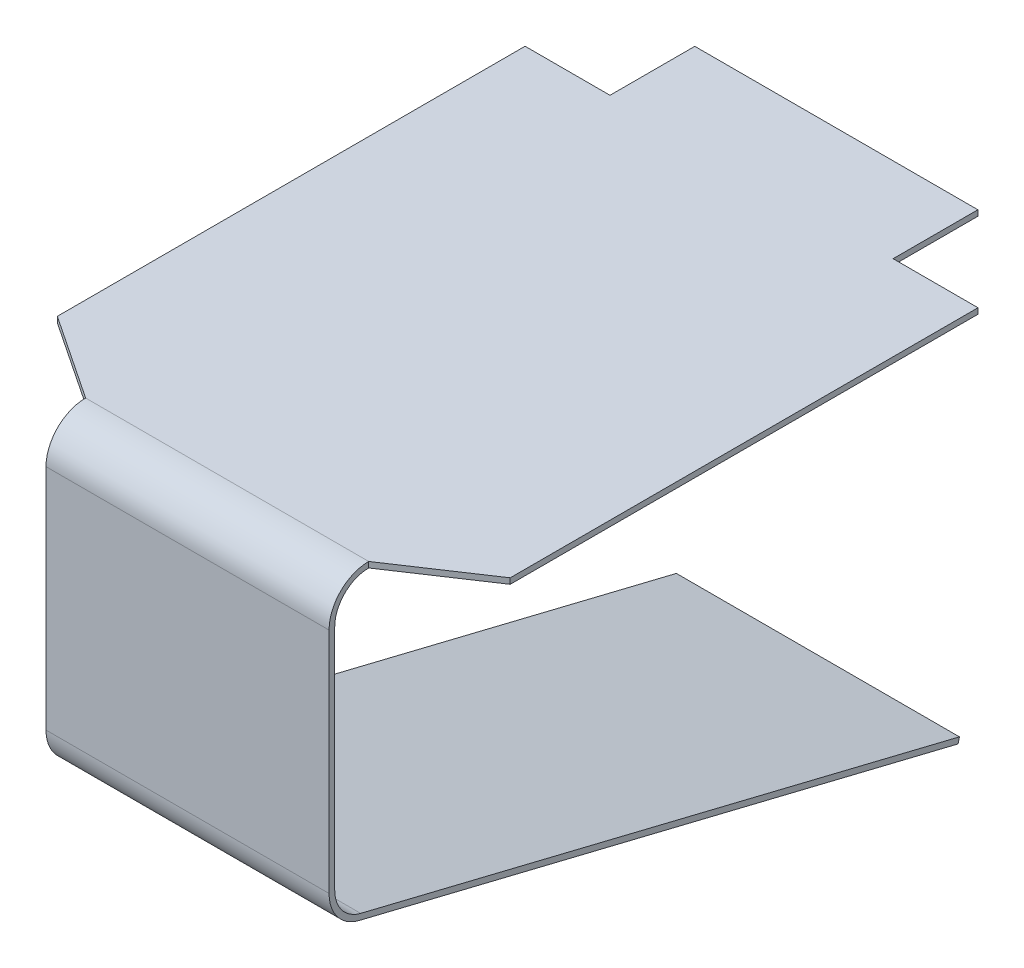
ISO-10303-21;
HEADER;
FILE_DESCRIPTION(('STEP AP214'),'2;1');
FILE_NAME('part.step','',(''),(''),'','','');
FILE_SCHEMA(('AUTOMOTIVE_DESIGN { 1 0 10303 214 1 1 1 1 }'));
ENDSEC;
DATA;
#1=APPLICATION_CONTEXT('core data for automotive mechanical design processes');
#2=APPLICATION_PROTOCOL_DEFINITION('international standard','automotive_design',2000,#1);
#3=PRODUCT_CONTEXT('',#1,'mechanical');
#4=PRODUCT('Part','Part','',(#3));
#5=PRODUCT_RELATED_PRODUCT_CATEGORY('part','',(#4));
#6=PRODUCT_DEFINITION_FORMATION('','',#4);
#7=PRODUCT_DEFINITION_CONTEXT('part definition',#1,'design');
#8=PRODUCT_DEFINITION('design','',#6,#7);
#9=PRODUCT_DEFINITION_SHAPE('','',#8);
#10=(LENGTH_UNIT() NAMED_UNIT(*) SI_UNIT(.MILLI.,.METRE.));
#11=(NAMED_UNIT(*) PLANE_ANGLE_UNIT() SI_UNIT($,.RADIAN.));
#12=(NAMED_UNIT(*) SI_UNIT($,.STERADIAN.) SOLID_ANGLE_UNIT());
#13=UNCERTAINTY_MEASURE_WITH_UNIT(LENGTH_MEASURE(1.E-05),#10,'distance_accuracy_value','');
#14=(GEOMETRIC_REPRESENTATION_CONTEXT(3) GLOBAL_UNCERTAINTY_ASSIGNED_CONTEXT((#13)) GLOBAL_UNIT_ASSIGNED_CONTEXT((#10,
#11,#12)) REPRESENTATION_CONTEXT('',''));
#15=CARTESIAN_POINT('',(0.,0.,0.));
#16=DIRECTION('',(0.,0.,1.));
#17=DIRECTION('',(1.,0.,0.));
#18=AXIS2_PLACEMENT_3D('',#15,#16,#17);
#19=CARTESIAN_POINT('',(-1.25,-2.31455604720542,5.38));
#20=DIRECTION('',(1.,0.,0.));
#21=DIRECTION('',(0.,0.,-1.));
#22=AXIS2_PLACEMENT_3D('',#19,#20,#21);
#23=PLANE('',#22);
#24=CARTESIAN_POINT('',(-1.25,-0.299999999999999,5.38));
#25=DIRECTION('',(1.,0.,0.));
#26=DIRECTION('',(0.,0.,-1.));
#27=AXIS2_PLACEMENT_3D('',#24,#25,#26);
#28=CIRCLE('',#27,0.35);
#29=CARTESIAN_POINT('',(-1.25,0.0500000000000008,5.38));
#30=VERTEX_POINT('',#29);
#31=CARTESIAN_POINT('',(-1.25,-0.300000000000001,5.73));
#32=VERTEX_POINT('',#31);
#33=EDGE_CURVE('E210',#30,#32,#28,.T.);
#34=ORIENTED_EDGE('',*,*,#33,.F.);
#35=DIRECTION('',(0.,-1.,0.));
#36=VECTOR('',#35,1.);
#37=CARTESIAN_POINT('',(-1.25,0.0500000000000008,5.38));
#38=LINE('',#37,#36);
#39=CARTESIAN_POINT('',(-1.25,0.,5.38));
#40=VERTEX_POINT('',#39);
#41=EDGE_CURVE('E181',#30,#40,#38,.T.);
#42=ORIENTED_EDGE('',*,*,#41,.T.);
#43=CARTESIAN_POINT('',(-1.25,-0.299999999999999,5.38));
#44=DIRECTION('',(1.,0.,0.));
#45=DIRECTION('',(0.,0.,1.));
#46=AXIS2_PLACEMENT_3D('',#43,#44,#45);
#47=CIRCLE('',#46,0.3);
#48=CARTESIAN_POINT('',(-1.25,-0.300000000000001,5.68));
#49=VERTEX_POINT('',#48);
#50=EDGE_CURVE('E284',#40,#49,#47,.T.);
#51=ORIENTED_EDGE('',*,*,#50,.T.);
#52=DIRECTION('',(0.,-1.,0.));
#53=VECTOR('',#52,1.);
#54=CARTESIAN_POINT('',(-1.25,-0.300000000000001,5.68));
#55=LINE('',#54,#53);
#56=CARTESIAN_POINT('',(-1.25,-2.31455604720542,5.68));
#57=VERTEX_POINT('',#56);
#58=EDGE_CURVE('E282',#49,#57,#55,.T.);
#59=ORIENTED_EDGE('',*,*,#58,.T.);
#60=CARTESIAN_POINT('',(-1.25,-2.31455604720542,5.38));
#61=DIRECTION('',(1.,0.,0.));
#62=DIRECTION('',(0.,0.,-1.));
#63=AXIS2_PLACEMENT_3D('',#60,#61,#62);
#64=CIRCLE('',#63,0.3);
#65=CARTESIAN_POINT('',(-1.25,-2.60595939018885,5.45130281690141));
#66=VERTEX_POINT('',#65);
#67=EDGE_CURVE('E280',#57,#66,#64,.T.);
#68=ORIENTED_EDGE('',*,*,#67,.T.);
#69=DIRECTION('',(0.,-0.237676056338028,-0.971344476611466));
#70=VECTOR('',#69,1.);
#71=CARTESIAN_POINT('',(-1.25,-2.60595939018885,5.45130281690141));
#72=LINE('',#71,#70);
#73=CARTESIAN_POINT('',(-1.25,-3.9,0.162763372846874));
#74=VERTEX_POINT('',#73);
#75=EDGE_CURVE('E278',#66,#74,#72,.T.);
#76=ORIENTED_EDGE('',*,*,#75,.T.);
#77=DIRECTION('',(0.,-0.971344476611468,0.237676056338017));
#78=VECTOR('',#77,1.);
#79=CARTESIAN_POINT('',(-1.25,-3.9,0.162763372846874));
#80=LINE('',#79,#78);
#81=CARTESIAN_POINT('',(-1.25,-3.94856722383057,0.174647175663775));
#82=VERTEX_POINT('',#81);
#83=EDGE_CURVE('E276',#74,#82,#80,.T.);
#84=ORIENTED_EDGE('',*,*,#83,.T.);
#85=DIRECTION('',(0.,-0.237676056338028,-0.971344476611466));
#86=VECTOR('',#85,1.);
#87=CARTESIAN_POINT('',(-1.25,-2.65452661401943,5.46318661971831));
#88=LINE('',#87,#86);
#89=CARTESIAN_POINT('',(-1.25,-2.65452661401943,5.46318661971831));
#90=VERTEX_POINT('',#89);
#91=EDGE_CURVE('E273',#90,#82,#88,.T.);
#92=ORIENTED_EDGE('',*,*,#91,.F.);
#93=CARTESIAN_POINT('',(-1.25,-2.31455604720542,5.38));
#94=DIRECTION('',(1.,0.,0.));
#95=DIRECTION('',(0.,0.,-1.));
#96=AXIS2_PLACEMENT_3D('',#93,#94,#95);
#97=CIRCLE('',#96,0.35);
#98=CARTESIAN_POINT('',(-1.25,-2.31455604720542,5.73));
#99=VERTEX_POINT('',#98);
#100=EDGE_CURVE('E220',#99,#90,#97,.T.);
#101=ORIENTED_EDGE('',*,*,#100,.F.);
#102=DIRECTION('',(0.,-1.,0.));
#103=VECTOR('',#102,1.);
#104=CARTESIAN_POINT('',(-1.25,-0.300000000000001,5.73));
#105=LINE('',#104,#103);
#106=EDGE_CURVE('E217',#32,#99,#105,.T.);
#107=ORIENTED_EDGE('',*,*,#106,.F.);
#108=EDGE_LOOP('',(#34,#42,#51,#59,#68,#76,#84,#92,#101,#107));
#109=FACE_BOUND('',#108,.T.);
#110=ADVANCED_FACE('F34',(#109),#23,.F.);
#111=CARTESIAN_POINT('',(1.25,-2.31455604720542,5.38));
#112=DIRECTION('',(1.,0.,0.));
#113=DIRECTION('',(0.,0.,-1.));
#114=AXIS2_PLACEMENT_3D('',#111,#112,#113);
#115=PLANE('',#114);
#116=DIRECTION('',(0.,-1.,0.));
#117=VECTOR('',#116,1.);
#118=CARTESIAN_POINT('',(1.25,0.0500000000000008,5.38));
#119=LINE('',#118,#117);
#120=CARTESIAN_POINT('',(1.25,0.0500000000000008,5.38));
#121=VERTEX_POINT('',#120);
#122=CARTESIAN_POINT('',(1.25,0.,5.38));
#123=VERTEX_POINT('',#122);
#124=EDGE_CURVE('E167',#121,#123,#119,.T.);
#125=ORIENTED_EDGE('',*,*,#124,.F.);
#126=CARTESIAN_POINT('',(1.25,-0.299999999999999,5.38));
#127=DIRECTION('',(1.,0.,0.));
#128=DIRECTION('',(0.,0.,-1.));
#129=AXIS2_PLACEMENT_3D('',#126,#127,#128);
#130=CIRCLE('',#129,0.35);
#131=CARTESIAN_POINT('',(1.25,-0.300000000000001,5.73));
#132=VERTEX_POINT('',#131);
#133=EDGE_CURVE('E264',#121,#132,#130,.T.);
#134=ORIENTED_EDGE('',*,*,#133,.T.);
#135=DIRECTION('',(0.,-1.,0.));
#136=VECTOR('',#135,1.);
#137=CARTESIAN_POINT('',(1.25,-0.300000000000001,5.73));
#138=LINE('',#137,#136);
#139=CARTESIAN_POINT('',(1.25,-2.31455604720542,5.73));
#140=VERTEX_POINT('',#139);
#141=EDGE_CURVE('E267',#132,#140,#138,.T.);
#142=ORIENTED_EDGE('',*,*,#141,.T.);
#143=CARTESIAN_POINT('',(1.25,-2.31455604720542,5.38));
#144=DIRECTION('',(1.,0.,0.));
#145=DIRECTION('',(0.,0.,-1.));
#146=AXIS2_PLACEMENT_3D('',#143,#144,#145);
#147=CIRCLE('',#146,0.35);
#148=CARTESIAN_POINT('',(1.25,-2.65452661401943,5.46318661971831));
#149=VERTEX_POINT('',#148);
#150=EDGE_CURVE('E270',#140,#149,#147,.T.);
#151=ORIENTED_EDGE('',*,*,#150,.T.);
#152=DIRECTION('',(0.,-0.237676056338028,-0.971344476611466));
#153=VECTOR('',#152,1.);
#154=CARTESIAN_POINT('',(1.25,-2.65452661401943,5.46318661971831));
#155=LINE('',#154,#153);
#156=CARTESIAN_POINT('',(1.25,-3.94856722383057,0.174647175663775));
#157=VERTEX_POINT('',#156);
#158=EDGE_CURVE('E329',#149,#157,#155,.T.);
#159=ORIENTED_EDGE('',*,*,#158,.T.);
#160=DIRECTION('',(0.,-0.971344476611468,0.237676056338017));
#161=VECTOR('',#160,1.);
#162=CARTESIAN_POINT('',(1.25,-3.9,0.162763372846874));
#163=LINE('',#162,#161);
#164=CARTESIAN_POINT('',(1.25,-3.9,0.162763372846874));
#165=VERTEX_POINT('',#164);
#166=EDGE_CURVE('E561',#165,#157,#163,.T.);
#167=ORIENTED_EDGE('',*,*,#166,.F.);
#168=DIRECTION('',(0.,-0.237676056338028,-0.971344476611466));
#169=VECTOR('',#168,1.);
#170=CARTESIAN_POINT('',(1.25,-2.60595939018885,5.45130281690141));
#171=LINE('',#170,#169);
#172=CARTESIAN_POINT('',(1.25,-2.60595939018885,5.45130281690141));
#173=VERTEX_POINT('',#172);
#174=EDGE_CURVE('E564',#173,#165,#171,.T.);
#175=ORIENTED_EDGE('',*,*,#174,.F.);
#176=CARTESIAN_POINT('',(1.25,-2.31455604720542,5.38));
#177=DIRECTION('',(1.,0.,0.));
#178=DIRECTION('',(0.,0.,-1.));
#179=AXIS2_PLACEMENT_3D('',#176,#177,#178);
#180=CIRCLE('',#179,0.3);
#181=CARTESIAN_POINT('',(1.25,-2.31455604720542,5.68));
#182=VERTEX_POINT('',#181);
#183=EDGE_CURVE('E565',#182,#173,#180,.T.);
#184=ORIENTED_EDGE('',*,*,#183,.F.);
#185=DIRECTION('',(0.,-1.,0.));
#186=VECTOR('',#185,1.);
#187=CARTESIAN_POINT('',(1.25,-0.300000000000001,5.68));
#188=LINE('',#187,#186);
#189=CARTESIAN_POINT('',(1.25,-0.300000000000001,5.68));
#190=VERTEX_POINT('',#189);
#191=EDGE_CURVE('E569',#190,#182,#188,.T.);
#192=ORIENTED_EDGE('',*,*,#191,.F.);
#193=CARTESIAN_POINT('',(1.25,-0.299999999999999,5.38));
#194=DIRECTION('',(1.,0.,0.));
#195=DIRECTION('',(0.,0.,1.));
#196=AXIS2_PLACEMENT_3D('',#193,#194,#195);
#197=CIRCLE('',#196,0.3);
#198=EDGE_CURVE('E253',#123,#190,#197,.T.);
#199=ORIENTED_EDGE('',*,*,#198,.F.);
#200=EDGE_LOOP('',(#125,#134,#142,#151,#159,#167,#175,#184,#192,#199));
#201=FACE_BOUND('',#200,.T.);
#202=ADVANCED_FACE('F314',(#201),#115,.T.);
#203=CARTESIAN_POINT('',(-1.25,-2.65452661401943,5.46318661971831));
#204=DIRECTION('',(0.,-0.971344476611466,0.237676056338028));
#205=DIRECTION('',(0.,-0.237676056338028,-0.971344476611466));
#206=AXIS2_PLACEMENT_3D('',#203,#204,#205);
#207=PLANE('',#206);
#208=DIRECTION('',(1.,0.,0.));
#209=VECTOR('',#208,1.);
#210=CARTESIAN_POINT('',(-1.25,-3.94856722383057,0.174647175663775));
#211=LINE('',#210,#209);
#212=EDGE_CURVE('E223',#82,#157,#211,.T.);
#213=ORIENTED_EDGE('',*,*,#212,.T.);
#214=ORIENTED_EDGE('',*,*,#158,.F.);
#215=DIRECTION('',(1.,0.,0.));
#216=VECTOR('',#215,1.);
#217=CARTESIAN_POINT('',(-1.25,-2.65452661401943,5.46318661971831));
#218=LINE('',#217,#216);
#219=EDGE_CURVE('E224',#90,#149,#218,.T.);
#220=ORIENTED_EDGE('',*,*,#219,.F.);
#221=ORIENTED_EDGE('',*,*,#91,.T.);
#222=EDGE_LOOP('',(#213,#214,#220,#221));
#223=FACE_BOUND('',#222,.T.);
#224=ADVANCED_FACE('F365',(#223),#207,.T.);
#225=CARTESIAN_POINT('',(-1.25,-2.31455604720542,5.38));
#226=DIRECTION('',(1.,0.,0.));
#227=DIRECTION('',(0.,0.,-1.));
#228=AXIS2_PLACEMENT_3D('',#225,#226,#227);
#229=CYLINDRICAL_SURFACE('',#228,0.35);
#230=ORIENTED_EDGE('',*,*,#219,.T.);
#231=ORIENTED_EDGE('',*,*,#150,.F.);
#232=DIRECTION('',(1.,0.,0.));
#233=VECTOR('',#232,1.);
#234=CARTESIAN_POINT('',(-1.25,-2.31455604720542,5.73));
#235=LINE('',#234,#233);
#236=EDGE_CURVE('E226',#99,#140,#235,.T.);
#237=ORIENTED_EDGE('',*,*,#236,.F.);
#238=ORIENTED_EDGE('',*,*,#100,.T.);
#239=EDGE_LOOP('',(#230,#231,#237,#238));
#240=FACE_BOUND('',#239,.T.);
#241=ADVANCED_FACE('F370',(#240),#229,.T.);
#242=CARTESIAN_POINT('',(-1.25,-0.300000000000001,5.73));
#243=DIRECTION('',(0.,0.,1.));
#244=DIRECTION('',(0.,-1.,0.));
#245=AXIS2_PLACEMENT_3D('',#242,#243,#244);
#246=PLANE('',#245);
#247=ORIENTED_EDGE('',*,*,#236,.T.);
#248=ORIENTED_EDGE('',*,*,#141,.F.);
#249=DIRECTION('',(1.,0.,0.));
#250=VECTOR('',#249,1.);
#251=CARTESIAN_POINT('',(-1.25,-0.300000000000001,5.73));
#252=LINE('',#251,#250);
#253=EDGE_CURVE('E228',#32,#132,#252,.T.);
#254=ORIENTED_EDGE('',*,*,#253,.F.);
#255=ORIENTED_EDGE('',*,*,#106,.T.);
#256=EDGE_LOOP('',(#247,#248,#254,#255));
#257=FACE_BOUND('',#256,.T.);
#258=ADVANCED_FACE('F311',(#257),#246,.T.);
#259=CARTESIAN_POINT('',(-1.25,-0.299999999999999,5.38));
#260=DIRECTION('',(1.,0.,0.));
#261=DIRECTION('',(0.,0.,-1.));
#262=AXIS2_PLACEMENT_3D('',#259,#260,#261);
#263=CYLINDRICAL_SURFACE('',#262,0.35);
#264=ORIENTED_EDGE('',*,*,#253,.T.);
#265=ORIENTED_EDGE('',*,*,#133,.F.);
#266=DIRECTION('',(1.,0.,0.));
#267=VECTOR('',#266,1.);
#268=CARTESIAN_POINT('',(-1.25,0.0500000000000008,5.38));
#269=LINE('',#268,#267);
#270=EDGE_CURVE('E230',#30,#121,#269,.T.);
#271=ORIENTED_EDGE('',*,*,#270,.F.);
#272=ORIENTED_EDGE('',*,*,#33,.T.);
#273=EDGE_LOOP('',(#264,#265,#271,#272));
#274=FACE_BOUND('',#273,.T.);
#275=ADVANCED_FACE('F306',(#274),#263,.T.);
#276=CARTESIAN_POINT('',(-1.25,0.05,0.));
#277=DIRECTION('',(0.,1.,0.));
#278=DIRECTION('',(0.,0.,1.));
#279=AXIS2_PLACEMENT_3D('',#276,#277,#278);
#280=PLANE('',#279);
#281=DIRECTION('',(0.,0.,1.));
#282=VECTOR('',#281,1.);
#283=CARTESIAN_POINT('',(-2.,0.0500000000000008,5.38));
#284=LINE('',#283,#282);
#285=CARTESIAN_POINT('',(-2.,0.0500000000000008,0.74883453473747));
#286=VERTEX_POINT('',#285);
#287=CARTESIAN_POINT('',(-2.,0.0500000000000008,4.88));
#288=VERTEX_POINT('',#287);
#289=EDGE_CURVE('E159',#286,#288,#284,.T.);
#290=ORIENTED_EDGE('',*,*,#289,.T.);
#291=DIRECTION('',(-0.832050294337844,0.,-0.554700196225228));
#292=VECTOR('',#291,1.);
#293=CARTESIAN_POINT('',(-3.73307692307692,0.0500000000000006,3.72461538461539));
#294=LINE('',#293,#292);
#295=EDGE_CURVE('E11',#288,#30,#294,.F.);
#296=ORIENTED_EDGE('',*,*,#295,.T.);
#297=ORIENTED_EDGE('',*,*,#270,.T.);
#298=DIRECTION('',(0.832050294337844,0.,-0.554700196225228));
#299=VECTOR('',#298,1.);
#300=CARTESIAN_POINT('',(2.00230769230769,0.0500000000000007,4.87846153846154));
#301=LINE('',#300,#299);
#302=CARTESIAN_POINT('',(2.,0.0500000000000008,4.88));
#303=VERTEX_POINT('',#302);
#304=EDGE_CURVE('E199',#121,#303,#301,.T.);
#305=ORIENTED_EDGE('',*,*,#304,.T.);
#306=DIRECTION('',(0.,0.,1.));
#307=VECTOR('',#306,1.);
#308=CARTESIAN_POINT('',(2.,0.0500000000000008,5.38));
#309=LINE('',#308,#307);
#310=CARTESIAN_POINT('',(2.,0.0500000000000008,0.74883453473747));
#311=VERTEX_POINT('',#310);
#312=EDGE_CURVE('E326',#311,#303,#309,.T.);
#313=ORIENTED_EDGE('',*,*,#312,.F.);
#314=DIRECTION('',(-1.,0.,0.));
#315=VECTOR('',#314,1.);
#316=CARTESIAN_POINT('',(2.,0.0500000000000008,0.74883453473747));
#317=LINE('',#316,#315);
#318=CARTESIAN_POINT('',(1.25,0.0500000000000008,0.74883453473747));
#319=VERTEX_POINT('',#318);
#320=EDGE_CURVE('E332',#311,#319,#317,.T.);
#321=ORIENTED_EDGE('',*,*,#320,.T.);
#322=DIRECTION('',(0.,0.,1.));
#323=VECTOR('',#322,1.);
#324=CARTESIAN_POINT('',(1.25,0.05,0.));
#325=LINE('',#324,#323);
#326=CARTESIAN_POINT('',(1.25,0.05,0.));
#327=VERTEX_POINT('',#326);
#328=EDGE_CURVE('E254',#327,#319,#325,.T.);
#329=ORIENTED_EDGE('',*,*,#328,.F.);
#330=DIRECTION('',(1.,0.,0.));
#331=VECTOR('',#330,1.);
#332=CARTESIAN_POINT('',(-1.25,0.05,0.));
#333=LINE('',#332,#331);
#334=CARTESIAN_POINT('',(-1.25,0.05,0.));
#335=VERTEX_POINT('',#334);
#336=EDGE_CURVE('E232',#335,#327,#333,.T.);
#337=ORIENTED_EDGE('',*,*,#336,.F.);
#338=DIRECTION('',(0.,0.,1.));
#339=VECTOR('',#338,1.);
#340=CARTESIAN_POINT('',(-1.25,0.05,0.));
#341=LINE('',#340,#339);
#342=CARTESIAN_POINT('',(-1.25,0.0500000000000001,0.74883453473747));
#343=VERTEX_POINT('',#342);
#344=EDGE_CURVE('E162',#335,#343,#341,.T.);
#345=ORIENTED_EDGE('',*,*,#344,.T.);
#346=DIRECTION('',(1.,0.,0.));
#347=VECTOR('',#346,1.);
#348=CARTESIAN_POINT('',(-2.,0.0500000000000008,0.74883453473747));
#349=LINE('',#348,#347);
#350=EDGE_CURVE('E157',#286,#343,#349,.T.);
#351=ORIENTED_EDGE('',*,*,#350,.F.);
#352=EDGE_LOOP('',(#290,#296,#297,#305,#313,#321,#329,#337,#345,#351));
#353=FACE_BOUND('',#352,.T.);
#354=ADVANCED_FACE('F158',(#353),#280,.T.);
#355=CARTESIAN_POINT('',(-1.25,0.05,0.));
#356=DIRECTION('',(0.,0.,1.));
#357=DIRECTION('',(0.,-1.,0.));
#358=AXIS2_PLACEMENT_3D('',#355,#356,#357);
#359=PLANE('',#358);
#360=ORIENTED_EDGE('',*,*,#336,.T.);
#361=DIRECTION('',(0.,-1.,0.));
#362=VECTOR('',#361,1.);
#363=CARTESIAN_POINT('',(1.25,0.05,0.));
#364=LINE('',#363,#362);
#365=CARTESIAN_POINT('',(1.25,0.,0.));
#366=VERTEX_POINT('',#365);
#367=EDGE_CURVE('E252',#327,#366,#364,.T.);
#368=ORIENTED_EDGE('',*,*,#367,.T.);
#369=DIRECTION('',(1.,0.,0.));
#370=VECTOR('',#369,1.);
#371=CARTESIAN_POINT('',(-1.25,0.,0.));
#372=LINE('',#371,#370);
#373=CARTESIAN_POINT('',(-1.25,0.,0.));
#374=VERTEX_POINT('',#373);
#375=EDGE_CURVE('E234',#374,#366,#372,.T.);
#376=ORIENTED_EDGE('',*,*,#375,.F.);
#377=DIRECTION('',(0.,-1.,0.));
#378=VECTOR('',#377,1.);
#379=CARTESIAN_POINT('',(-1.25,0.05,0.));
#380=LINE('',#379,#378);
#381=EDGE_CURVE('E211',#335,#374,#380,.T.);
#382=ORIENTED_EDGE('',*,*,#381,.F.);
#383=EDGE_LOOP('',(#360,#368,#376,#382));
#384=FACE_BOUND('',#383,.T.);
#385=ADVANCED_FACE('F296',(#384),#359,.F.);
#386=CARTESIAN_POINT('',(-1.25,0.,0.));
#387=DIRECTION('',(0.,1.,0.));
#388=DIRECTION('',(0.,0.,1.));
#389=AXIS2_PLACEMENT_3D('',#386,#387,#388);
#390=PLANE('',#389);
#391=DIRECTION('',(1.,0.,0.));
#392=VECTOR('',#391,1.);
#393=CARTESIAN_POINT('',(-1.25,0.,5.38));
#394=LINE('',#393,#392);
#395=EDGE_CURVE('E236',#40,#123,#394,.T.);
#396=ORIENTED_EDGE('',*,*,#395,.F.);
#397=DIRECTION('',(0.832050294337844,0.,0.554700196225228));
#398=VECTOR('',#397,1.);
#399=CARTESIAN_POINT('',(-1.25,0.,5.38));
#400=LINE('',#399,#398);
#401=CARTESIAN_POINT('',(-2.,0.,4.88));
#402=VERTEX_POINT('',#401);
#403=EDGE_CURVE('E56',#40,#402,#400,.F.);
#404=ORIENTED_EDGE('',*,*,#403,.T.);
#405=DIRECTION('',(0.,0.,-1.));
#406=VECTOR('',#405,1.);
#407=CARTESIAN_POINT('',(-2.,0.,5.38));
#408=LINE('',#407,#406);
#409=CARTESIAN_POINT('',(-2.,0.,0.74883453473747));
#410=VERTEX_POINT('',#409);
#411=EDGE_CURVE('E177',#402,#410,#408,.T.);
#412=ORIENTED_EDGE('',*,*,#411,.T.);
#413=DIRECTION('',(1.,0.,0.));
#414=VECTOR('',#413,1.);
#415=CARTESIAN_POINT('',(-2.,0.,0.74883453473747));
#416=LINE('',#415,#414);
#417=CARTESIAN_POINT('',(-1.25,0.,0.74883453473747));
#418=VERTEX_POINT('',#417);
#419=EDGE_CURVE('E168',#410,#418,#416,.T.);
#420=ORIENTED_EDGE('',*,*,#419,.T.);
#421=DIRECTION('',(0.,0.,1.));
#422=VECTOR('',#421,1.);
#423=CARTESIAN_POINT('',(-1.25,0.,0.));
#424=LINE('',#423,#422);
#425=EDGE_CURVE('E190',#374,#418,#424,.T.);
#426=ORIENTED_EDGE('',*,*,#425,.F.);
#427=ORIENTED_EDGE('',*,*,#375,.T.);
#428=DIRECTION('',(0.,0.,1.));
#429=VECTOR('',#428,1.);
#430=CARTESIAN_POINT('',(1.25,0.,0.));
#431=LINE('',#430,#429);
#432=CARTESIAN_POINT('',(1.25,0.,0.74883453473747));
#433=VERTEX_POINT('',#432);
#434=EDGE_CURVE('E248',#366,#433,#431,.T.);
#435=ORIENTED_EDGE('',*,*,#434,.T.);
#436=DIRECTION('',(-1.,0.,0.));
#437=VECTOR('',#436,1.);
#438=CARTESIAN_POINT('',(2.,0.,0.74883453473747));
#439=LINE('',#438,#437);
#440=CARTESIAN_POINT('',(2.,0.,0.74883453473747));
#441=VERTEX_POINT('',#440);
#442=EDGE_CURVE('E335',#441,#433,#439,.T.);
#443=ORIENTED_EDGE('',*,*,#442,.F.);
#444=DIRECTION('',(0.,0.,-1.));
#445=VECTOR('',#444,1.);
#446=CARTESIAN_POINT('',(2.,0.,5.38));
#447=LINE('',#446,#445);
#448=CARTESIAN_POINT('',(2.,0.,4.88));
#449=VERTEX_POINT('',#448);
#450=EDGE_CURVE('E186',#449,#441,#447,.T.);
#451=ORIENTED_EDGE('',*,*,#450,.F.);
#452=DIRECTION('',(-0.832050294337844,0.,0.554700196225228));
#453=VECTOR('',#452,1.);
#454=CARTESIAN_POINT('',(2.,0.,4.88));
#455=LINE('',#454,#453);
#456=EDGE_CURVE('E200',#449,#123,#455,.T.);
#457=ORIENTED_EDGE('',*,*,#456,.T.);
#458=EDGE_LOOP('',(#396,#404,#412,#420,#426,#427,#435,#443,#451,#457));
#459=FACE_BOUND('',#458,.T.);
#460=ADVANCED_FACE('F299',(#459),#390,.F.);
#461=CARTESIAN_POINT('',(-1.25,-0.299999999999999,5.38));
#462=DIRECTION('',(1.,0.,0.));
#463=DIRECTION('',(0.,0.,-1.));
#464=AXIS2_PLACEMENT_3D('',#461,#462,#463);
#465=CYLINDRICAL_SURFACE('',#464,0.3);
#466=ORIENTED_EDGE('',*,*,#395,.T.);
#467=ORIENTED_EDGE('',*,*,#198,.T.);
#468=DIRECTION('',(1.,0.,0.));
#469=VECTOR('',#468,1.);
#470=CARTESIAN_POINT('',(-1.25,-0.300000000000001,5.68));
#471=LINE('',#470,#469);
#472=EDGE_CURVE('E239',#49,#190,#471,.T.);
#473=ORIENTED_EDGE('',*,*,#472,.F.);
#474=ORIENTED_EDGE('',*,*,#50,.F.);
#475=EDGE_LOOP('',(#466,#467,#473,#474));
#476=FACE_BOUND('',#475,.T.);
#477=ADVANCED_FACE('F384',(#476),#465,.F.);
#478=CARTESIAN_POINT('',(-1.25,-0.300000000000001,5.68));
#479=DIRECTION('',(0.,0.,1.));
#480=DIRECTION('',(0.,-1.,0.));
#481=AXIS2_PLACEMENT_3D('',#478,#479,#480);
#482=PLANE('',#481);
#483=ORIENTED_EDGE('',*,*,#472,.T.);
#484=ORIENTED_EDGE('',*,*,#191,.T.);
#485=DIRECTION('',(1.,0.,0.));
#486=VECTOR('',#485,1.);
#487=CARTESIAN_POINT('',(-1.25,-2.31455604720542,5.68));
#488=LINE('',#487,#486);
#489=EDGE_CURVE('E241',#57,#182,#488,.T.);
#490=ORIENTED_EDGE('',*,*,#489,.F.);
#491=ORIENTED_EDGE('',*,*,#58,.F.);
#492=EDGE_LOOP('',(#483,#484,#490,#491));
#493=FACE_BOUND('',#492,.T.);
#494=ADVANCED_FACE('F387',(#493),#482,.F.);
#495=CARTESIAN_POINT('',(-1.25,-2.31455604720542,5.38));
#496=DIRECTION('',(1.,0.,0.));
#497=DIRECTION('',(0.,0.,-1.));
#498=AXIS2_PLACEMENT_3D('',#495,#496,#497);
#499=CYLINDRICAL_SURFACE('',#498,0.3);
#500=ORIENTED_EDGE('',*,*,#489,.T.);
#501=ORIENTED_EDGE('',*,*,#183,.T.);
#502=DIRECTION('',(1.,0.,0.));
#503=VECTOR('',#502,1.);
#504=CARTESIAN_POINT('',(-1.25,-2.60595939018885,5.45130281690141));
#505=LINE('',#504,#503);
#506=EDGE_CURVE('E243',#66,#173,#505,.T.);
#507=ORIENTED_EDGE('',*,*,#506,.F.);
#508=ORIENTED_EDGE('',*,*,#67,.F.);
#509=EDGE_LOOP('',(#500,#501,#507,#508));
#510=FACE_BOUND('',#509,.T.);
#511=ADVANCED_FACE('F391',(#510),#499,.F.);
#512=CARTESIAN_POINT('',(-1.25,-2.60595939018885,5.45130281690141));
#513=DIRECTION('',(0.,-0.971344476611466,0.237676056338028));
#514=DIRECTION('',(0.,-0.237676056338028,-0.971344476611466));
#515=AXIS2_PLACEMENT_3D('',#512,#513,#514);
#516=PLANE('',#515);
#517=ORIENTED_EDGE('',*,*,#506,.T.);
#518=ORIENTED_EDGE('',*,*,#174,.T.);
#519=DIRECTION('',(1.,0.,0.));
#520=VECTOR('',#519,1.);
#521=CARTESIAN_POINT('',(-1.25,-3.9,0.162763372846874));
#522=LINE('',#521,#520);
#523=EDGE_CURVE('E245',#74,#165,#522,.T.);
#524=ORIENTED_EDGE('',*,*,#523,.F.);
#525=ORIENTED_EDGE('',*,*,#75,.F.);
#526=EDGE_LOOP('',(#517,#518,#524,#525));
#527=FACE_BOUND('',#526,.T.);
#528=ADVANCED_FACE('F395',(#527),#516,.F.);
#529=CARTESIAN_POINT('',(-1.25,-3.9,0.162763372846874));
#530=DIRECTION('',(0.,0.237676056338017,0.971344476611468));
#531=DIRECTION('',(0.,-0.971344476611468,0.237676056338017));
#532=AXIS2_PLACEMENT_3D('',#529,#530,#531);
#533=PLANE('',#532);
#534=ORIENTED_EDGE('',*,*,#523,.T.);
#535=ORIENTED_EDGE('',*,*,#166,.T.);
#536=ORIENTED_EDGE('',*,*,#212,.F.);
#537=ORIENTED_EDGE('',*,*,#83,.F.);
#538=EDGE_LOOP('',(#534,#535,#536,#537));
#539=FACE_BOUND('',#538,.T.);
#540=ADVANCED_FACE('F362',(#539),#533,.F.);
#541=ORIENTED_EDGE('',*,*,#425,.T.);
#542=DIRECTION('',(0.,1.,0.));
#543=VECTOR('',#542,1.);
#544=CARTESIAN_POINT('',(-1.25,0.0500000000000008,0.74883453473747));
#545=LINE('',#544,#543);
#546=EDGE_CURVE('E173',#418,#343,#545,.T.);
#547=ORIENTED_EDGE('',*,*,#546,.T.);
#548=ORIENTED_EDGE('',*,*,#344,.F.);
#549=ORIENTED_EDGE('',*,*,#381,.T.);
#550=EDGE_LOOP('',(#541,#547,#548,#549));
#551=FACE_BOUND('',#550,.T.);
#552=ADVANCED_FACE('F294',(#551),#23,.F.);
#553=DIRECTION('',(0.,1.,0.));
#554=VECTOR('',#553,1.);
#555=CARTESIAN_POINT('',(1.25,0.0500000000000008,0.74883453473747));
#556=LINE('',#555,#554);
#557=EDGE_CURVE('E321',#433,#319,#556,.T.);
#558=ORIENTED_EDGE('',*,*,#557,.F.);
#559=ORIENTED_EDGE('',*,*,#434,.F.);
#560=ORIENTED_EDGE('',*,*,#367,.F.);
#561=ORIENTED_EDGE('',*,*,#328,.T.);
#562=EDGE_LOOP('',(#558,#559,#560,#561));
#563=FACE_BOUND('',#562,.T.);
#564=ADVANCED_FACE('F354',(#563),#115,.T.);
#565=CARTESIAN_POINT('',(2.,0.0500000000000008,0.74883453473747));
#566=DIRECTION('',(0.,0.,1.));
#567=DIRECTION('',(1.,0.,0.));
#568=AXIS2_PLACEMENT_3D('',#565,#566,#567);
#569=PLANE('',#568);
#570=ORIENTED_EDGE('',*,*,#557,.T.);
#571=ORIENTED_EDGE('',*,*,#320,.F.);
#572=DIRECTION('',(0.,1.,0.));
#573=VECTOR('',#572,1.);
#574=CARTESIAN_POINT('',(2.,0.0500000000000008,0.74883453473747));
#575=LINE('',#574,#573);
#576=EDGE_CURVE('E348',#441,#311,#575,.T.);
#577=ORIENTED_EDGE('',*,*,#576,.F.);
#578=ORIENTED_EDGE('',*,*,#442,.T.);
#579=EDGE_LOOP('',(#570,#571,#577,#578));
#580=FACE_BOUND('',#579,.T.);
#581=ADVANCED_FACE('F351',(#580),#569,.F.);
#582=CARTESIAN_POINT('',(2.,0.,0.));
#583=DIRECTION('',(1.,0.,0.));
#584=DIRECTION('',(0.,0.,-1.));
#585=AXIS2_PLACEMENT_3D('',#582,#583,#584);
#586=PLANE('',#585);
#587=ORIENTED_EDGE('',*,*,#312,.T.);
#588=DIRECTION('',(0.,-1.,0.));
#589=VECTOR('',#588,1.);
#590=CARTESIAN_POINT('',(2.,0.,4.88));
#591=LINE('',#590,#589);
#592=EDGE_CURVE('E206',#303,#449,#591,.T.);
#593=ORIENTED_EDGE('',*,*,#592,.T.);
#594=ORIENTED_EDGE('',*,*,#450,.T.);
#595=ORIENTED_EDGE('',*,*,#576,.T.);
#596=EDGE_LOOP('',(#587,#593,#594,#595));
#597=FACE_BOUND('',#596,.T.);
#598=ADVANCED_FACE('F345',(#597),#586,.T.);
#599=CARTESIAN_POINT('',(2.,0.,4.88));
#600=DIRECTION('',(0.554700196225228,0.,0.832050294337844));
#601=DIRECTION('',(0.,1.,0.));
#602=AXIS2_PLACEMENT_3D('',#599,#600,#601);
#603=PLANE('',#602);
#604=ORIENTED_EDGE('',*,*,#304,.F.);
#605=ORIENTED_EDGE('',*,*,#124,.T.);
#606=ORIENTED_EDGE('',*,*,#456,.F.);
#607=ORIENTED_EDGE('',*,*,#592,.F.);
#608=EDGE_LOOP('',(#604,#605,#606,#607));
#609=FACE_BOUND('',#608,.T.);
#610=ADVANCED_FACE('F405',(#609),#603,.T.);
#611=CARTESIAN_POINT('',(-2.,0.0500000000000008,0.74883453473747));
#612=DIRECTION('',(0.,0.,-1.));
#613=DIRECTION('',(-1.,0.,0.));
#614=AXIS2_PLACEMENT_3D('',#611,#612,#613);
#615=PLANE('',#614);
#616=ORIENTED_EDGE('',*,*,#546,.F.);
#617=ORIENTED_EDGE('',*,*,#419,.F.);
#618=DIRECTION('',(0.,1.,0.));
#619=VECTOR('',#618,1.);
#620=CARTESIAN_POINT('',(-2.,0.0500000000000008,0.74883453473747));
#621=LINE('',#620,#619);
#622=EDGE_CURVE('E172',#410,#286,#621,.T.);
#623=ORIENTED_EDGE('',*,*,#622,.T.);
#624=ORIENTED_EDGE('',*,*,#350,.T.);
#625=EDGE_LOOP('',(#616,#617,#623,#624));
#626=FACE_BOUND('',#625,.T.);
#627=ADVANCED_FACE('F176',(#626),#615,.T.);
#628=CARTESIAN_POINT('',(-2.,0.,0.));
#629=DIRECTION('',(-1.,0.,0.));
#630=DIRECTION('',(0.,0.,-1.));
#631=AXIS2_PLACEMENT_3D('',#628,#629,#630);
#632=PLANE('',#631);
#633=ORIENTED_EDGE('',*,*,#411,.F.);
#634=DIRECTION('',(0.,1.,0.));
#635=VECTOR('',#634,1.);
#636=CARTESIAN_POINT('',(-2.,0.,4.88));
#637=LINE('',#636,#635);
#638=EDGE_CURVE('E42',#402,#288,#637,.T.);
#639=ORIENTED_EDGE('',*,*,#638,.T.);
#640=ORIENTED_EDGE('',*,*,#289,.F.);
#641=ORIENTED_EDGE('',*,*,#622,.F.);
#642=EDGE_LOOP('',(#633,#639,#640,#641));
#643=FACE_BOUND('',#642,.T.);
#644=ADVANCED_FACE('F171',(#643),#632,.T.);
#645=CARTESIAN_POINT('',(-1.25,0.0500000000000008,5.38));
#646=DIRECTION('',(0.554700196225228,0.,-0.832050294337844));
#647=DIRECTION('',(0.,-1.,0.));
#648=AXIS2_PLACEMENT_3D('',#645,#646,#647);
#649=PLANE('',#648);
#650=ORIENTED_EDGE('',*,*,#295,.F.);
#651=ORIENTED_EDGE('',*,*,#638,.F.);
#652=ORIENTED_EDGE('',*,*,#403,.F.);
#653=ORIENTED_EDGE('',*,*,#41,.F.);
#654=EDGE_LOOP('',(#650,#651,#652,#653));
#655=FACE_BOUND('',#654,.T.);
#656=ADVANCED_FACE('F36',(#655),#649,.F.);
#657=CLOSED_SHELL('',(#110,#202,#224,#241,#258,#275,#354,#385,#460,#477,#494,#511,#528,#540,
#552,#564,#581,#598,#610,#627,#644,#656));
#658=MANIFOLD_SOLID_BREP('B2',#657);
#659=ADVANCED_BREP_SHAPE_REPRESENTATION('',(#18,#658),#14);
#660=SHAPE_DEFINITION_REPRESENTATION(#9,#659);
ENDSEC;
END-ISO-10303-21;
